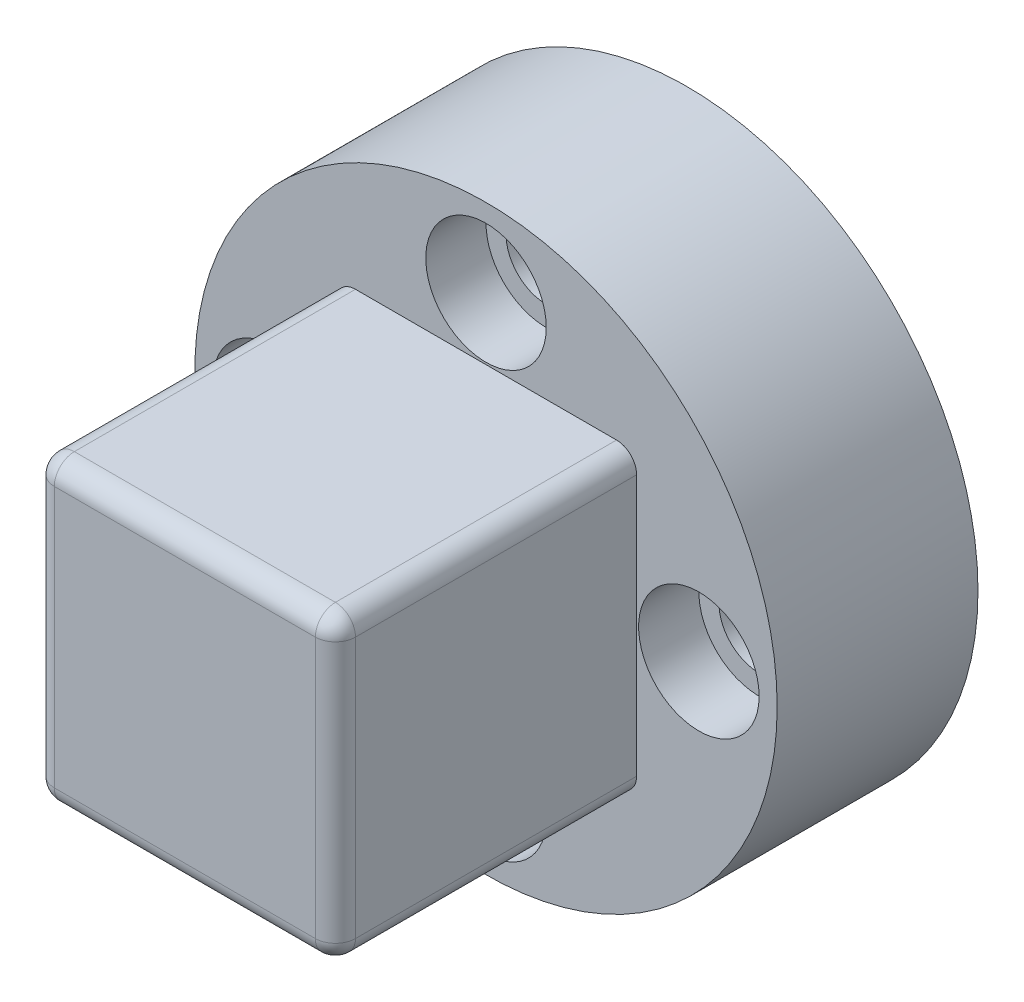
ISO-10303-21;
HEADER;
FILE_DESCRIPTION(('STEP AP214'),'2;1');
FILE_NAME('part.step','',(''),(''),'','','');
FILE_SCHEMA(('AUTOMOTIVE_DESIGN { 1 0 10303 214 1 1 1 1 }'));
ENDSEC;
DATA;
#1=APPLICATION_CONTEXT('core data for automotive mechanical design processes');
#2=APPLICATION_PROTOCOL_DEFINITION('international standard','automotive_design',2000,#1);
#3=PRODUCT_CONTEXT('',#1,'mechanical');
#4=PRODUCT('Part','Part','',(#3));
#5=PRODUCT_RELATED_PRODUCT_CATEGORY('part','',(#4));
#6=PRODUCT_DEFINITION_FORMATION('','',#4);
#7=PRODUCT_DEFINITION_CONTEXT('part definition',#1,'design');
#8=PRODUCT_DEFINITION('design','',#6,#7);
#9=PRODUCT_DEFINITION_SHAPE('','',#8);
#10=(LENGTH_UNIT() NAMED_UNIT(*) SI_UNIT(.MILLI.,.METRE.));
#11=(NAMED_UNIT(*) PLANE_ANGLE_UNIT() SI_UNIT($,.RADIAN.));
#12=(NAMED_UNIT(*) SI_UNIT($,.STERADIAN.) SOLID_ANGLE_UNIT());
#13=UNCERTAINTY_MEASURE_WITH_UNIT(LENGTH_MEASURE(1.E-05),#10,'distance_accuracy_value','');
#14=(GEOMETRIC_REPRESENTATION_CONTEXT(3) GLOBAL_UNCERTAINTY_ASSIGNED_CONTEXT((#13)) GLOBAL_UNIT_ASSIGNED_CONTEXT((#10,
#11,#12)) REPRESENTATION_CONTEXT('',''));
#15=CARTESIAN_POINT('',(0.,0.,0.));
#16=DIRECTION('',(0.,0.,1.));
#17=DIRECTION('',(1.,0.,0.));
#18=AXIS2_PLACEMENT_3D('',#15,#16,#17);
#19=CARTESIAN_POINT('',(0.,0.,7.));
#20=DIRECTION('',(0.,0.,1.));
#21=DIRECTION('',(1.,0.,0.));
#22=AXIS2_PLACEMENT_3D('',#19,#20,#21);
#23=PLANE('',#22);
#24=CARTESIAN_POINT('',(10.6,0.,7.));
#25=DIRECTION('',(0.,0.,1.));
#26=DIRECTION('',(1.,0.,0.));
#27=AXIS2_PLACEMENT_3D('',#24,#25,#26);
#28=CIRCLE('',#27,2.);
#29=CARTESIAN_POINT('',(12.6,0.,7.));
#30=VERTEX_POINT('',#29);
#31=EDGE_CURVE('E285',#30,#30,#28,.T.);
#32=ORIENTED_EDGE('',*,*,#31,.F.);
#33=EDGE_LOOP('',(#32));
#34=FACE_BOUND('',#33,.T.);
#35=CARTESIAN_POINT('',(10.6,0.,7.));
#36=DIRECTION('',(0.,0.,1.));
#37=DIRECTION('',(1.,0.,0.));
#38=AXIS2_PLACEMENT_3D('',#35,#36,#37);
#39=CIRCLE('',#38,3.);
#40=CARTESIAN_POINT('',(13.6,0.,7.));
#41=VERTEX_POINT('',#40);
#42=EDGE_CURVE('E239',#41,#41,#39,.T.);
#43=ORIENTED_EDGE('',*,*,#42,.T.);
#44=EDGE_LOOP('',(#43));
#45=FACE_BOUND('',#44,.T.);
#46=ADVANCED_FACE('F58',(#34,#45),#23,.T.);
#47=CARTESIAN_POINT('',(0.,-10.6,7.));
#48=DIRECTION('',(0.,0.,1.));
#49=DIRECTION('',(1.,0.,0.));
#50=AXIS2_PLACEMENT_3D('',#47,#48,#49);
#51=CIRCLE('',#50,2.);
#52=CARTESIAN_POINT('',(2.,-10.6,7.));
#53=VERTEX_POINT('',#52);
#54=EDGE_CURVE('E279',#53,#53,#51,.T.);
#55=ORIENTED_EDGE('',*,*,#54,.F.);
#56=EDGE_LOOP('',(#55));
#57=FACE_BOUND('',#56,.T.);
#58=CARTESIAN_POINT('',(0.,-10.6,7.));
#59=DIRECTION('',(0.,0.,1.));
#60=DIRECTION('',(1.,0.,0.));
#61=AXIS2_PLACEMENT_3D('',#58,#59,#60);
#62=CIRCLE('',#61,3.);
#63=CARTESIAN_POINT('',(3.,-10.6,7.));
#64=VERTEX_POINT('',#63);
#65=EDGE_CURVE('E259',#64,#64,#62,.T.);
#66=ORIENTED_EDGE('',*,*,#65,.T.);
#67=EDGE_LOOP('',(#66));
#68=FACE_BOUND('',#67,.T.);
#69=ADVANCED_FACE('F335',(#57,#68),#23,.T.);
#70=CARTESIAN_POINT('',(-10.6,0.,7.));
#71=DIRECTION('',(0.,0.,1.));
#72=DIRECTION('',(1.,0.,0.));
#73=AXIS2_PLACEMENT_3D('',#70,#71,#72);
#74=CIRCLE('',#73,2.);
#75=CARTESIAN_POINT('',(-8.6,0.,7.));
#76=VERTEX_POINT('',#75);
#77=EDGE_CURVE('E267',#76,#76,#74,.T.);
#78=ORIENTED_EDGE('',*,*,#77,.F.);
#79=EDGE_LOOP('',(#78));
#80=FACE_BOUND('',#79,.T.);
#81=CARTESIAN_POINT('',(-10.6,0.,7.));
#82=DIRECTION('',(0.,0.,1.));
#83=DIRECTION('',(1.,0.,0.));
#84=AXIS2_PLACEMENT_3D('',#81,#82,#83);
#85=CIRCLE('',#84,3.);
#86=CARTESIAN_POINT('',(-7.6,0.,7.));
#87=VERTEX_POINT('',#86);
#88=EDGE_CURVE('E262',#87,#87,#85,.T.);
#89=ORIENTED_EDGE('',*,*,#88,.T.);
#90=EDGE_LOOP('',(#89));
#91=FACE_BOUND('',#90,.T.);
#92=ADVANCED_FACE('F342',(#80,#91),#23,.T.);
#93=CARTESIAN_POINT('',(0.,10.6,7.));
#94=DIRECTION('',(0.,0.,1.));
#95=DIRECTION('',(1.,0.,0.));
#96=AXIS2_PLACEMENT_3D('',#93,#94,#95);
#97=CIRCLE('',#96,2.);
#98=CARTESIAN_POINT('',(2.,10.6,7.));
#99=VERTEX_POINT('',#98);
#100=EDGE_CURVE('E273',#99,#99,#97,.T.);
#101=ORIENTED_EDGE('',*,*,#100,.F.);
#102=EDGE_LOOP('',(#101));
#103=FACE_BOUND('',#102,.T.);
#104=CARTESIAN_POINT('',(0.,10.6,7.));
#105=DIRECTION('',(0.,0.,1.));
#106=DIRECTION('',(1.,0.,0.));
#107=AXIS2_PLACEMENT_3D('',#104,#105,#106);
#108=CIRCLE('',#107,3.);
#109=CARTESIAN_POINT('',(3.,10.6,7.));
#110=VERTEX_POINT('',#109);
#111=EDGE_CURVE('E244',#110,#110,#108,.T.);
#112=ORIENTED_EDGE('',*,*,#111,.T.);
#113=EDGE_LOOP('',(#112));
#114=FACE_BOUND('',#113,.T.);
#115=ADVANCED_FACE('F338',(#103,#114),#23,.T.);
#116=CARTESIAN_POINT('',(0.,0.,0.));
#117=DIRECTION('',(0.,0.,1.));
#118=DIRECTION('',(1.,0.,0.));
#119=AXIS2_PLACEMENT_3D('',#116,#117,#118);
#120=PLANE('',#119);
#121=CARTESIAN_POINT('',(0.,0.,0.));
#122=DIRECTION('',(0.,0.,1.));
#123=DIRECTION('',(1.,0.,0.));
#124=AXIS2_PLACEMENT_3D('',#121,#122,#123);
#125=CIRCLE('',#124,14.5);
#126=CARTESIAN_POINT('',(14.5,0.,0.));
#127=VERTEX_POINT('',#126);
#128=EDGE_CURVE('E165',#127,#127,#125,.T.);
#129=ORIENTED_EDGE('',*,*,#128,.F.);
#130=EDGE_LOOP('',(#129));
#131=FACE_BOUND('',#130,.T.);
#132=CARTESIAN_POINT('',(10.6,0.,0.));
#133=DIRECTION('',(0.,0.,1.));
#134=DIRECTION('',(1.,0.,0.));
#135=AXIS2_PLACEMENT_3D('',#132,#133,#134);
#136=CIRCLE('',#135,2.);
#137=CARTESIAN_POINT('',(12.6,0.,0.));
#138=VERTEX_POINT('',#137);
#139=EDGE_CURVE('E282',#138,#138,#136,.T.);
#140=ORIENTED_EDGE('',*,*,#139,.T.);
#141=EDGE_LOOP('',(#140));
#142=FACE_BOUND('',#141,.T.);
#143=CARTESIAN_POINT('',(0.,-10.6,0.));
#144=DIRECTION('',(0.,0.,1.));
#145=DIRECTION('',(1.,0.,0.));
#146=AXIS2_PLACEMENT_3D('',#143,#144,#145);
#147=CIRCLE('',#146,2.);
#148=CARTESIAN_POINT('',(2.,-10.6,0.));
#149=VERTEX_POINT('',#148);
#150=EDGE_CURVE('E276',#149,#149,#147,.T.);
#151=ORIENTED_EDGE('',*,*,#150,.T.);
#152=EDGE_LOOP('',(#151));
#153=FACE_BOUND('',#152,.T.);
#154=CARTESIAN_POINT('',(0.,10.6,0.));
#155=DIRECTION('',(0.,0.,1.));
#156=DIRECTION('',(1.,0.,0.));
#157=AXIS2_PLACEMENT_3D('',#154,#155,#156);
#158=CIRCLE('',#157,2.);
#159=CARTESIAN_POINT('',(2.,10.6,0.));
#160=VERTEX_POINT('',#159);
#161=EDGE_CURVE('E270',#160,#160,#158,.T.);
#162=ORIENTED_EDGE('',*,*,#161,.T.);
#163=EDGE_LOOP('',(#162));
#164=FACE_BOUND('',#163,.T.);
#165=CARTESIAN_POINT('',(-10.6,0.,0.));
#166=DIRECTION('',(0.,0.,1.));
#167=DIRECTION('',(1.,0.,0.));
#168=AXIS2_PLACEMENT_3D('',#165,#166,#167);
#169=CIRCLE('',#168,2.);
#170=CARTESIAN_POINT('',(-8.6,0.,0.));
#171=VERTEX_POINT('',#170);
#172=EDGE_CURVE('E256',#171,#171,#169,.T.);
#173=ORIENTED_EDGE('',*,*,#172,.T.);
#174=EDGE_LOOP('',(#173));
#175=FACE_BOUND('',#174,.T.);
#176=ADVANCED_FACE('F349',(#131,#142,#153,#164,#175),#120,.F.);
#177=CARTESIAN_POINT('',(0.,0.,7.));
#178=DIRECTION('',(0.,0.,-1.));
#179=DIRECTION('',(-1.,0.,0.));
#180=AXIS2_PLACEMENT_3D('',#177,#178,#179);
#181=CYLINDRICAL_SURFACE('',#180,14.5);
#182=ORIENTED_EDGE('',*,*,#128,.T.);
#183=EDGE_LOOP('',(#182));
#184=FACE_BOUND('',#183,.T.);
#185=CARTESIAN_POINT('',(0.,0.,10.));
#186=DIRECTION('',(0.,0.,1.));
#187=DIRECTION('',(1.,0.,0.));
#188=AXIS2_PLACEMENT_3D('',#185,#186,#187);
#189=CIRCLE('',#188,14.5);
#190=CARTESIAN_POINT('',(14.5,0.,10.));
#191=VERTEX_POINT('',#190);
#192=EDGE_CURVE('E253',#191,#191,#189,.T.);
#193=ORIENTED_EDGE('',*,*,#192,.F.);
#194=EDGE_LOOP('',(#193));
#195=FACE_BOUND('',#194,.T.);
#196=ADVANCED_FACE('F355',(#184,#195),#181,.T.);
#197=CARTESIAN_POINT('',(10.6,0.,7.));
#198=DIRECTION('',(0.,0.,-1.));
#199=DIRECTION('',(-1.,0.,0.));
#200=AXIS2_PLACEMENT_3D('',#197,#198,#199);
#201=CYLINDRICAL_SURFACE('',#200,2.);
#202=ORIENTED_EDGE('',*,*,#31,.T.);
#203=EDGE_LOOP('',(#202));
#204=FACE_BOUND('',#203,.T.);
#205=ORIENTED_EDGE('',*,*,#139,.F.);
#206=EDGE_LOOP('',(#205));
#207=FACE_BOUND('',#206,.T.);
#208=ADVANCED_FACE('F393',(#204,#207),#201,.F.);
#209=CARTESIAN_POINT('',(0.,-10.6,7.));
#210=DIRECTION('',(0.,0.,-1.));
#211=DIRECTION('',(-1.,0.,0.));
#212=AXIS2_PLACEMENT_3D('',#209,#210,#211);
#213=CYLINDRICAL_SURFACE('',#212,2.);
#214=ORIENTED_EDGE('',*,*,#54,.T.);
#215=EDGE_LOOP('',(#214));
#216=FACE_BOUND('',#215,.T.);
#217=ORIENTED_EDGE('',*,*,#150,.F.);
#218=EDGE_LOOP('',(#217));
#219=FACE_BOUND('',#218,.T.);
#220=ADVANCED_FACE('F390',(#216,#219),#213,.F.);
#221=CARTESIAN_POINT('',(0.,10.6,7.));
#222=DIRECTION('',(0.,0.,-1.));
#223=DIRECTION('',(-1.,0.,0.));
#224=AXIS2_PLACEMENT_3D('',#221,#222,#223);
#225=CYLINDRICAL_SURFACE('',#224,2.);
#226=ORIENTED_EDGE('',*,*,#100,.T.);
#227=EDGE_LOOP('',(#226));
#228=FACE_BOUND('',#227,.T.);
#229=ORIENTED_EDGE('',*,*,#161,.F.);
#230=EDGE_LOOP('',(#229));
#231=FACE_BOUND('',#230,.T.);
#232=ADVANCED_FACE('F375',(#228,#231),#225,.F.);
#233=CARTESIAN_POINT('',(-10.6,0.,7.));
#234=DIRECTION('',(0.,0.,-1.));
#235=DIRECTION('',(-1.,0.,0.));
#236=AXIS2_PLACEMENT_3D('',#233,#234,#235);
#237=CYLINDRICAL_SURFACE('',#236,2.);
#238=ORIENTED_EDGE('',*,*,#77,.T.);
#239=EDGE_LOOP('',(#238));
#240=FACE_BOUND('',#239,.T.);
#241=ORIENTED_EDGE('',*,*,#172,.F.);
#242=EDGE_LOOP('',(#241));
#243=FACE_BOUND('',#242,.T.);
#244=ADVANCED_FACE('F365',(#240,#243),#237,.F.);
#245=CARTESIAN_POINT('',(0.,10.6,10.));
#246=DIRECTION('',(0.,0.,-1.));
#247=DIRECTION('',(-1.,0.,0.));
#248=AXIS2_PLACEMENT_3D('',#245,#246,#247);
#249=CYLINDRICAL_SURFACE('',#248,3.);
#250=CARTESIAN_POINT('',(0.,10.6,10.));
#251=DIRECTION('',(0.,0.,1.));
#252=DIRECTION('',(1.,0.,0.));
#253=AXIS2_PLACEMENT_3D('',#250,#251,#252);
#254=CIRCLE('',#253,3.);
#255=CARTESIAN_POINT('',(3.,10.6,10.));
#256=VERTEX_POINT('',#255);
#257=EDGE_CURVE('E250',#256,#256,#254,.T.);
#258=ORIENTED_EDGE('',*,*,#257,.T.);
#259=EDGE_LOOP('',(#258));
#260=FACE_BOUND('',#259,.T.);
#261=ORIENTED_EDGE('',*,*,#111,.F.);
#262=EDGE_LOOP('',(#261));
#263=FACE_BOUND('',#262,.T.);
#264=ADVANCED_FACE('F362',(#260,#263),#249,.F.);
#265=CARTESIAN_POINT('',(-10.6,0.,10.));
#266=DIRECTION('',(0.,0.,-1.));
#267=DIRECTION('',(-1.,0.,0.));
#268=AXIS2_PLACEMENT_3D('',#265,#266,#267);
#269=CYLINDRICAL_SURFACE('',#268,3.);
#270=CARTESIAN_POINT('',(-10.6,0.,10.));
#271=DIRECTION('',(0.,0.,1.));
#272=DIRECTION('',(1.,0.,0.));
#273=AXIS2_PLACEMENT_3D('',#270,#271,#272);
#274=CIRCLE('',#273,3.);
#275=CARTESIAN_POINT('',(-7.6,0.,10.));
#276=VERTEX_POINT('',#275);
#277=EDGE_CURVE('E247',#276,#276,#274,.T.);
#278=ORIENTED_EDGE('',*,*,#277,.T.);
#279=EDGE_LOOP('',(#278));
#280=FACE_BOUND('',#279,.T.);
#281=ORIENTED_EDGE('',*,*,#88,.F.);
#282=EDGE_LOOP('',(#281));
#283=FACE_BOUND('',#282,.T.);
#284=ADVANCED_FACE('F364',(#280,#283),#269,.F.);
#285=CARTESIAN_POINT('',(0.,-10.6,10.));
#286=DIRECTION('',(0.,0.,-1.));
#287=DIRECTION('',(-1.,0.,0.));
#288=AXIS2_PLACEMENT_3D('',#285,#286,#287);
#289=CYLINDRICAL_SURFACE('',#288,3.);
#290=CARTESIAN_POINT('',(0.,-10.6,10.));
#291=DIRECTION('',(0.,0.,1.));
#292=DIRECTION('',(1.,0.,0.));
#293=AXIS2_PLACEMENT_3D('',#290,#291,#292);
#294=CIRCLE('',#293,3.);
#295=CARTESIAN_POINT('',(3.,-10.6,10.));
#296=VERTEX_POINT('',#295);
#297=EDGE_CURVE('E243',#296,#296,#294,.T.);
#298=ORIENTED_EDGE('',*,*,#297,.T.);
#299=EDGE_LOOP('',(#298));
#300=FACE_BOUND('',#299,.T.);
#301=ORIENTED_EDGE('',*,*,#65,.F.);
#302=EDGE_LOOP('',(#301));
#303=FACE_BOUND('',#302,.T.);
#304=ADVANCED_FACE('F372',(#300,#303),#289,.F.);
#305=CARTESIAN_POINT('',(10.6,0.,10.));
#306=DIRECTION('',(0.,0.,-1.));
#307=DIRECTION('',(-1.,0.,0.));
#308=AXIS2_PLACEMENT_3D('',#305,#306,#307);
#309=CYLINDRICAL_SURFACE('',#308,3.);
#310=CARTESIAN_POINT('',(10.6,0.,10.));
#311=DIRECTION('',(0.,0.,1.));
#312=DIRECTION('',(1.,0.,0.));
#313=AXIS2_PLACEMENT_3D('',#310,#311,#312);
#314=CIRCLE('',#313,3.);
#315=CARTESIAN_POINT('',(13.6,0.,10.));
#316=VERTEX_POINT('',#315);
#317=EDGE_CURVE('E240',#316,#316,#314,.T.);
#318=ORIENTED_EDGE('',*,*,#317,.T.);
#319=EDGE_LOOP('',(#318));
#320=FACE_BOUND('',#319,.T.);
#321=ORIENTED_EDGE('',*,*,#42,.F.);
#322=EDGE_LOOP('',(#321));
#323=FACE_BOUND('',#322,.T.);
#324=ADVANCED_FACE('F383',(#320,#323),#309,.F.);
#325=CARTESIAN_POINT('',(0.,0.,10.));
#326=DIRECTION('',(0.,0.,1.));
#327=DIRECTION('',(1.,0.,0.));
#328=AXIS2_PLACEMENT_3D('',#325,#326,#327);
#329=PLANE('',#328);
#330=DIRECTION('',(0.,1.,0.));
#331=VECTOR('',#330,1.);
#332=CARTESIAN_POINT('',(7.5,-7.5,10.));
#333=LINE('',#332,#331);
#334=CARTESIAN_POINT('',(7.5,-6.5,10.));
#335=VERTEX_POINT('',#334);
#336=CARTESIAN_POINT('',(7.5,6.5,10.));
#337=VERTEX_POINT('',#336);
#338=EDGE_CURVE('E223',#335,#337,#333,.T.);
#339=ORIENTED_EDGE('',*,*,#338,.F.);
#340=CARTESIAN_POINT('',(6.5,-6.5,10.));
#341=DIRECTION('',(0.,0.,1.));
#342=DIRECTION('',(1.,0.,0.));
#343=AXIS2_PLACEMENT_3D('',#340,#341,#342);
#344=CIRCLE('',#343,1.);
#345=CARTESIAN_POINT('',(6.5,-7.5,10.));
#346=VERTEX_POINT('',#345);
#347=EDGE_CURVE('E67',#335,#346,#344,.F.);
#348=ORIENTED_EDGE('',*,*,#347,.T.);
#349=DIRECTION('',(1.,0.,0.));
#350=VECTOR('',#349,1.);
#351=CARTESIAN_POINT('',(-7.5,-7.5,10.));
#352=LINE('',#351,#350);
#353=CARTESIAN_POINT('',(-6.5,-7.5,10.));
#354=VERTEX_POINT('',#353);
#355=EDGE_CURVE('E236',#354,#346,#352,.T.);
#356=ORIENTED_EDGE('',*,*,#355,.F.);
#357=CARTESIAN_POINT('',(-6.5,-6.5,10.));
#358=DIRECTION('',(0.,0.,1.));
#359=DIRECTION('',(1.,0.,0.));
#360=AXIS2_PLACEMENT_3D('',#357,#358,#359);
#361=CIRCLE('',#360,1.);
#362=CARTESIAN_POINT('',(-7.5,-6.5,10.));
#363=VERTEX_POINT('',#362);
#364=EDGE_CURVE('E12',#354,#363,#361,.F.);
#365=ORIENTED_EDGE('',*,*,#364,.T.);
#366=DIRECTION('',(0.,-1.,0.));
#367=VECTOR('',#366,1.);
#368=CARTESIAN_POINT('',(-7.5,-7.5,10.));
#369=LINE('',#368,#367);
#370=CARTESIAN_POINT('',(-7.5,6.5,10.));
#371=VERTEX_POINT('',#370);
#372=EDGE_CURVE('E232',#371,#363,#369,.T.);
#373=ORIENTED_EDGE('',*,*,#372,.F.);
#374=CARTESIAN_POINT('',(-6.5,6.5,10.));
#375=DIRECTION('',(0.,0.,1.));
#376=DIRECTION('',(1.,0.,0.));
#377=AXIS2_PLACEMENT_3D('',#374,#375,#376);
#378=CIRCLE('',#377,1.);
#379=CARTESIAN_POINT('',(-6.5,7.5,10.));
#380=VERTEX_POINT('',#379);
#381=EDGE_CURVE('E196',#371,#380,#378,.F.);
#382=ORIENTED_EDGE('',*,*,#381,.T.);
#383=DIRECTION('',(-1.,0.,0.));
#384=VECTOR('',#383,1.);
#385=CARTESIAN_POINT('',(-7.5,7.5,10.));
#386=LINE('',#385,#384);
#387=CARTESIAN_POINT('',(6.5,7.5,10.));
#388=VERTEX_POINT('',#387);
#389=EDGE_CURVE('E226',#388,#380,#386,.T.);
#390=ORIENTED_EDGE('',*,*,#389,.F.);
#391=CARTESIAN_POINT('',(6.5,6.5,10.));
#392=DIRECTION('',(0.,0.,1.));
#393=DIRECTION('',(1.,0.,0.));
#394=AXIS2_PLACEMENT_3D('',#391,#392,#393);
#395=CIRCLE('',#394,1.);
#396=EDGE_CURVE('E198',#388,#337,#395,.F.);
#397=ORIENTED_EDGE('',*,*,#396,.T.);
#398=EDGE_LOOP('',(#339,#348,#356,#365,#373,#382,#390,#397));
#399=FACE_BOUND('',#398,.T.);
#400=ORIENTED_EDGE('',*,*,#317,.F.);
#401=EDGE_LOOP('',(#400));
#402=FACE_BOUND('',#401,.T.);
#403=ORIENTED_EDGE('',*,*,#297,.F.);
#404=EDGE_LOOP('',(#403));
#405=FACE_BOUND('',#404,.T.);
#406=ORIENTED_EDGE('',*,*,#277,.F.);
#407=EDGE_LOOP('',(#406));
#408=FACE_BOUND('',#407,.T.);
#409=ORIENTED_EDGE('',*,*,#257,.F.);
#410=EDGE_LOOP('',(#409));
#411=FACE_BOUND('',#410,.T.);
#412=ORIENTED_EDGE('',*,*,#192,.T.);
#413=EDGE_LOOP('',(#412));
#414=FACE_BOUND('',#413,.T.);
#415=ADVANCED_FACE('F317',(#399,#402,#405,#408,#411,#414),#329,.T.);
#416=CARTESIAN_POINT('',(7.5,-7.5,25.));
#417=DIRECTION('',(-1.,0.,0.));
#418=DIRECTION('',(0.,0.,1.));
#419=AXIS2_PLACEMENT_3D('',#416,#417,#418);
#420=PLANE('',#419);
#421=ORIENTED_EDGE('',*,*,#338,.T.);
#422=DIRECTION('',(0.,0.,-1.));
#423=VECTOR('',#422,1.);
#424=CARTESIAN_POINT('',(7.5,6.5,25.));
#425=LINE('',#424,#423);
#426=CARTESIAN_POINT('',(7.5,6.5,24.));
#427=VERTEX_POINT('',#426);
#428=EDGE_CURVE('E184',#337,#427,#425,.F.);
#429=ORIENTED_EDGE('',*,*,#428,.T.);
#430=DIRECTION('',(0.,1.,0.));
#431=VECTOR('',#430,1.);
#432=CARTESIAN_POINT('',(7.5,-7.5,24.));
#433=LINE('',#432,#431);
#434=CARTESIAN_POINT('',(7.5,-6.5,24.));
#435=VERTEX_POINT('',#434);
#436=EDGE_CURVE('E182',#427,#435,#433,.F.);
#437=ORIENTED_EDGE('',*,*,#436,.T.);
#438=DIRECTION('',(0.,0.,-1.));
#439=VECTOR('',#438,1.);
#440=CARTESIAN_POINT('',(7.5,-6.5,25.));
#441=LINE('',#440,#439);
#442=EDGE_CURVE('E180',#435,#335,#441,.T.);
#443=ORIENTED_EDGE('',*,*,#442,.T.);
#444=EDGE_LOOP('',(#421,#429,#437,#443));
#445=FACE_BOUND('',#444,.T.);
#446=ADVANCED_FACE('F529',(#445),#420,.F.);
#447=CARTESIAN_POINT('',(-7.5,7.5,25.));
#448=DIRECTION('',(0.,-1.,0.));
#449=DIRECTION('',(0.,0.,-1.));
#450=AXIS2_PLACEMENT_3D('',#447,#448,#449);
#451=PLANE('',#450);
#452=ORIENTED_EDGE('',*,*,#389,.T.);
#453=DIRECTION('',(0.,0.,-1.));
#454=VECTOR('',#453,1.);
#455=CARTESIAN_POINT('',(-6.5,7.5,25.));
#456=LINE('',#455,#454);
#457=CARTESIAN_POINT('',(-6.5,7.5,24.));
#458=VERTEX_POINT('',#457);
#459=EDGE_CURVE('E178',#380,#458,#456,.F.);
#460=ORIENTED_EDGE('',*,*,#459,.T.);
#461=DIRECTION('',(-1.,0.,0.));
#462=VECTOR('',#461,1.);
#463=CARTESIAN_POINT('',(-7.5,7.5,24.));
#464=LINE('',#463,#462);
#465=CARTESIAN_POINT('',(6.5,7.5,24.));
#466=VERTEX_POINT('',#465);
#467=EDGE_CURVE('E143',#458,#466,#464,.F.);
#468=ORIENTED_EDGE('',*,*,#467,.T.);
#469=DIRECTION('',(0.,0.,-1.));
#470=VECTOR('',#469,1.);
#471=CARTESIAN_POINT('',(6.5,7.5,25.));
#472=LINE('',#471,#470);
#473=EDGE_CURVE('E171',#466,#388,#472,.T.);
#474=ORIENTED_EDGE('',*,*,#473,.T.);
#475=EDGE_LOOP('',(#452,#460,#468,#474));
#476=FACE_BOUND('',#475,.T.);
#477=ADVANCED_FACE('F309',(#476),#451,.F.);
#478=CARTESIAN_POINT('',(-7.5,-7.5,25.));
#479=DIRECTION('',(1.,0.,0.));
#480=DIRECTION('',(0.,0.,-1.));
#481=AXIS2_PLACEMENT_3D('',#478,#479,#480);
#482=PLANE('',#481);
#483=DIRECTION('',(0.,-1.,0.));
#484=VECTOR('',#483,1.);
#485=CARTESIAN_POINT('',(-7.5,-7.5,24.));
#486=LINE('',#485,#484);
#487=CARTESIAN_POINT('',(-7.5,-6.5,24.));
#488=VERTEX_POINT('',#487);
#489=CARTESIAN_POINT('',(-7.5,6.5,24.));
#490=VERTEX_POINT('',#489);
#491=EDGE_CURVE('E75',#488,#490,#486,.F.);
#492=ORIENTED_EDGE('',*,*,#491,.T.);
#493=DIRECTION('',(0.,0.,-1.));
#494=VECTOR('',#493,1.);
#495=CARTESIAN_POINT('',(-7.5,6.5,25.));
#496=LINE('',#495,#494);
#497=EDGE_CURVE('E194',#490,#371,#496,.T.);
#498=ORIENTED_EDGE('',*,*,#497,.T.);
#499=ORIENTED_EDGE('',*,*,#372,.T.);
#500=DIRECTION('',(0.,0.,-1.));
#501=VECTOR('',#500,1.);
#502=CARTESIAN_POINT('',(-7.5,-6.5,25.));
#503=LINE('',#502,#501);
#504=EDGE_CURVE('E80',#363,#488,#503,.F.);
#505=ORIENTED_EDGE('',*,*,#504,.T.);
#506=EDGE_LOOP('',(#492,#498,#499,#505));
#507=FACE_BOUND('',#506,.T.);
#508=ADVANCED_FACE('F315',(#507),#482,.F.);
#509=CARTESIAN_POINT('',(-7.5,-7.5,25.));
#510=DIRECTION('',(0.,1.,0.));
#511=DIRECTION('',(0.,0.,1.));
#512=AXIS2_PLACEMENT_3D('',#509,#510,#511);
#513=PLANE('',#512);
#514=ORIENTED_EDGE('',*,*,#355,.T.);
#515=DIRECTION('',(0.,0.,-1.));
#516=VECTOR('',#515,1.);
#517=CARTESIAN_POINT('',(6.5,-7.5,25.));
#518=LINE('',#517,#516);
#519=CARTESIAN_POINT('',(6.5,-7.5,24.));
#520=VERTEX_POINT('',#519);
#521=EDGE_CURVE('E190',#346,#520,#518,.F.);
#522=ORIENTED_EDGE('',*,*,#521,.T.);
#523=DIRECTION('',(1.,0.,0.));
#524=VECTOR('',#523,1.);
#525=CARTESIAN_POINT('',(-7.5,-7.5,24.));
#526=LINE('',#525,#524);
#527=CARTESIAN_POINT('',(-6.5,-7.5,24.));
#528=VERTEX_POINT('',#527);
#529=EDGE_CURVE('E188',#520,#528,#526,.F.);
#530=ORIENTED_EDGE('',*,*,#529,.T.);
#531=DIRECTION('',(0.,0.,-1.));
#532=VECTOR('',#531,1.);
#533=CARTESIAN_POINT('',(-6.5,-7.5,25.));
#534=LINE('',#533,#532);
#535=EDGE_CURVE('E186',#528,#354,#534,.T.);
#536=ORIENTED_EDGE('',*,*,#535,.T.);
#537=EDGE_LOOP('',(#514,#522,#530,#536));
#538=FACE_BOUND('',#537,.T.);
#539=ADVANCED_FACE('F506',(#538),#513,.F.);
#540=CARTESIAN_POINT('',(0.,0.,25.));
#541=DIRECTION('',(0.,0.,-1.));
#542=DIRECTION('',(-1.,0.,0.));
#543=AXIS2_PLACEMENT_3D('',#540,#541,#542);
#544=PLANE('',#543);
#545=DIRECTION('',(0.,1.,0.));
#546=VECTOR('',#545,1.);
#547=CARTESIAN_POINT('',(6.5,0.,25.));
#548=LINE('',#547,#546);
#549=CARTESIAN_POINT('',(6.5,-6.5,25.));
#550=VERTEX_POINT('',#549);
#551=CARTESIAN_POINT('',(6.5,6.5,25.));
#552=VERTEX_POINT('',#551);
#553=EDGE_CURVE('E169',#550,#552,#548,.T.);
#554=ORIENTED_EDGE('',*,*,#553,.T.);
#555=DIRECTION('',(-1.,0.,0.));
#556=VECTOR('',#555,1.);
#557=CARTESIAN_POINT('',(0.,6.5,25.));
#558=LINE('',#557,#556);
#559=CARTESIAN_POINT('',(-6.5,6.5,25.));
#560=VERTEX_POINT('',#559);
#561=EDGE_CURVE('E141',#552,#560,#558,.T.);
#562=ORIENTED_EDGE('',*,*,#561,.T.);
#563=DIRECTION('',(0.,-1.,0.));
#564=VECTOR('',#563,1.);
#565=CARTESIAN_POINT('',(-6.5,0.,25.));
#566=LINE('',#565,#564);
#567=CARTESIAN_POINT('',(-6.5,-6.5,25.));
#568=VERTEX_POINT('',#567);
#569=EDGE_CURVE('E158',#560,#568,#566,.T.);
#570=ORIENTED_EDGE('',*,*,#569,.T.);
#571=DIRECTION('',(1.,0.,0.));
#572=VECTOR('',#571,1.);
#573=CARTESIAN_POINT('',(0.,-6.5,25.));
#574=LINE('',#573,#572);
#575=EDGE_CURVE('E164',#568,#550,#574,.T.);
#576=ORIENTED_EDGE('',*,*,#575,.T.);
#577=EDGE_LOOP('',(#554,#562,#570,#576));
#578=FACE_BOUND('',#577,.T.);
#579=ADVANCED_FACE('F167',(#578),#544,.F.);
#580=CARTESIAN_POINT('',(6.5,-6.5,25.));
#581=DIRECTION('',(0.,0.,-1.));
#582=DIRECTION('',(-1.,0.,0.));
#583=AXIS2_PLACEMENT_3D('',#580,#581,#582);
#584=CYLINDRICAL_SURFACE('',#583,1.);
#585=ORIENTED_EDGE('',*,*,#347,.F.);
#586=ORIENTED_EDGE('',*,*,#442,.F.);
#587=CARTESIAN_POINT('',(6.5,-6.5,24.));
#588=DIRECTION('',(0.,0.,1.));
#589=DIRECTION('',(1.,0.,0.));
#590=AXIS2_PLACEMENT_3D('',#587,#588,#589);
#591=CIRCLE('',#590,1.);
#592=EDGE_CURVE('E62',#520,#435,#591,.T.);
#593=ORIENTED_EDGE('',*,*,#592,.F.);
#594=ORIENTED_EDGE('',*,*,#521,.F.);
#595=EDGE_LOOP('',(#585,#586,#593,#594));
#596=FACE_BOUND('',#595,.T.);
#597=ADVANCED_FACE('F60',(#596),#584,.T.);
#598=CARTESIAN_POINT('',(0.,-6.5,24.));
#599=DIRECTION('',(1.,0.,0.));
#600=DIRECTION('',(0.,0.,-1.));
#601=AXIS2_PLACEMENT_3D('',#598,#599,#600);
#602=CYLINDRICAL_SURFACE('',#601,1.);
#603=CARTESIAN_POINT('',(-6.5,-6.5,24.));
#604=DIRECTION('',(-1.,0.,0.));
#605=DIRECTION('',(0.,0.,1.));
#606=AXIS2_PLACEMENT_3D('',#603,#604,#605);
#607=CIRCLE('',#606,1.);
#608=EDGE_CURVE('E215',#528,#568,#607,.T.);
#609=ORIENTED_EDGE('',*,*,#608,.F.);
#610=ORIENTED_EDGE('',*,*,#529,.F.);
#611=CARTESIAN_POINT('',(6.5,-6.5,24.));
#612=DIRECTION('',(1.,0.,0.));
#613=DIRECTION('',(0.,0.,-1.));
#614=AXIS2_PLACEMENT_3D('',#611,#612,#613);
#615=CIRCLE('',#614,1.);
#616=EDGE_CURVE('E217',#550,#520,#615,.T.);
#617=ORIENTED_EDGE('',*,*,#616,.F.);
#618=ORIENTED_EDGE('',*,*,#575,.F.);
#619=EDGE_LOOP('',(#609,#610,#617,#618));
#620=FACE_BOUND('',#619,.T.);
#621=ADVANCED_FACE('F294',(#620),#602,.T.);
#622=CARTESIAN_POINT('',(-6.5,-6.5,25.));
#623=DIRECTION('',(0.,0.,-1.));
#624=DIRECTION('',(-1.,0.,0.));
#625=AXIS2_PLACEMENT_3D('',#622,#623,#624);
#626=CYLINDRICAL_SURFACE('',#625,1.);
#627=ORIENTED_EDGE('',*,*,#364,.F.);
#628=ORIENTED_EDGE('',*,*,#535,.F.);
#629=CARTESIAN_POINT('',(-6.5,-6.5,24.));
#630=DIRECTION('',(0.,0.,1.));
#631=DIRECTION('',(1.,0.,0.));
#632=AXIS2_PLACEMENT_3D('',#629,#630,#631);
#633=CIRCLE('',#632,1.);
#634=EDGE_CURVE('E212',#488,#528,#633,.T.);
#635=ORIENTED_EDGE('',*,*,#634,.F.);
#636=ORIENTED_EDGE('',*,*,#504,.F.);
#637=EDGE_LOOP('',(#627,#628,#635,#636));
#638=FACE_BOUND('',#637,.T.);
#639=ADVANCED_FACE('F323',(#638),#626,.T.);
#640=CARTESIAN_POINT('',(6.5,-6.5,24.));
#641=DIRECTION('',(0.,0.,1.));
#642=DIRECTION('',(1.,0.,0.));
#643=AXIS2_PLACEMENT_3D('',#640,#641,#642);
#644=SPHERICAL_SURFACE('',#643,1.);
#645=ORIENTED_EDGE('',*,*,#616,.T.);
#646=ORIENTED_EDGE('',*,*,#592,.T.);
#647=CARTESIAN_POINT('',(6.5,-6.5,24.));
#648=DIRECTION('',(0.,-1.,0.));
#649=DIRECTION('',(0.,0.,-1.));
#650=AXIS2_PLACEMENT_3D('',#647,#648,#649);
#651=CIRCLE('',#650,1.);
#652=EDGE_CURVE('E209',#550,#435,#651,.F.);
#653=ORIENTED_EDGE('',*,*,#652,.F.);
#654=EDGE_LOOP('',(#645,#646,#653));
#655=FACE_BOUND('',#654,.T.);
#656=ADVANCED_FACE('F295',(#655),#644,.T.);
#657=CARTESIAN_POINT('',(-6.5,-6.5,24.));
#658=DIRECTION('',(0.,0.,1.));
#659=DIRECTION('',(1.,0.,0.));
#660=AXIS2_PLACEMENT_3D('',#657,#658,#659);
#661=SPHERICAL_SURFACE('',#660,1.);
#662=ORIENTED_EDGE('',*,*,#634,.T.);
#663=ORIENTED_EDGE('',*,*,#608,.T.);
#664=CARTESIAN_POINT('',(-6.5,-6.5,24.));
#665=DIRECTION('',(0.,-1.,0.));
#666=DIRECTION('',(0.,0.,-1.));
#667=AXIS2_PLACEMENT_3D('',#664,#665,#666);
#668=CIRCLE('',#667,1.);
#669=EDGE_CURVE('E161',#488,#568,#668,.F.);
#670=ORIENTED_EDGE('',*,*,#669,.F.);
#671=EDGE_LOOP('',(#662,#663,#670));
#672=FACE_BOUND('',#671,.T.);
#673=ADVANCED_FACE('F325',(#672),#661,.T.);
#674=CARTESIAN_POINT('',(6.5,6.5,25.));
#675=DIRECTION('',(0.,0.,-1.));
#676=DIRECTION('',(-1.,0.,0.));
#677=AXIS2_PLACEMENT_3D('',#674,#675,#676);
#678=CYLINDRICAL_SURFACE('',#677,1.);
#679=ORIENTED_EDGE('',*,*,#396,.F.);
#680=ORIENTED_EDGE('',*,*,#473,.F.);
#681=CARTESIAN_POINT('',(6.5,6.5,24.));
#682=DIRECTION('',(0.,0.,1.));
#683=DIRECTION('',(1.,0.,0.));
#684=AXIS2_PLACEMENT_3D('',#681,#682,#683);
#685=CIRCLE('',#684,1.);
#686=EDGE_CURVE('E205',#427,#466,#685,.T.);
#687=ORIENTED_EDGE('',*,*,#686,.F.);
#688=ORIENTED_EDGE('',*,*,#428,.F.);
#689=EDGE_LOOP('',(#679,#680,#687,#688));
#690=FACE_BOUND('',#689,.T.);
#691=ADVANCED_FACE('F306',(#690),#678,.T.);
#692=CARTESIAN_POINT('',(6.5,0.,24.));
#693=DIRECTION('',(0.,1.,0.));
#694=DIRECTION('',(0.,0.,1.));
#695=AXIS2_PLACEMENT_3D('',#692,#693,#694);
#696=CYLINDRICAL_SURFACE('',#695,1.);
#697=ORIENTED_EDGE('',*,*,#652,.T.);
#698=ORIENTED_EDGE('',*,*,#436,.F.);
#699=CARTESIAN_POINT('',(6.5,6.5,24.));
#700=DIRECTION('',(0.,1.,0.));
#701=DIRECTION('',(0.,0.,1.));
#702=AXIS2_PLACEMENT_3D('',#699,#700,#701);
#703=CIRCLE('',#702,1.);
#704=EDGE_CURVE('E155',#552,#427,#703,.T.);
#705=ORIENTED_EDGE('',*,*,#704,.F.);
#706=ORIENTED_EDGE('',*,*,#553,.F.);
#707=EDGE_LOOP('',(#697,#698,#705,#706));
#708=FACE_BOUND('',#707,.T.);
#709=ADVANCED_FACE('F298',(#708),#696,.T.);
#710=CARTESIAN_POINT('',(-6.5,0.,24.));
#711=DIRECTION('',(0.,-1.,0.));
#712=DIRECTION('',(0.,0.,-1.));
#713=AXIS2_PLACEMENT_3D('',#710,#711,#712);
#714=CYLINDRICAL_SURFACE('',#713,1.);
#715=ORIENTED_EDGE('',*,*,#669,.T.);
#716=ORIENTED_EDGE('',*,*,#569,.F.);
#717=CARTESIAN_POINT('',(-6.5,6.5,24.));
#718=DIRECTION('',(0.,1.,0.));
#719=DIRECTION('',(0.,0.,1.));
#720=AXIS2_PLACEMENT_3D('',#717,#718,#719);
#721=CIRCLE('',#720,1.);
#722=EDGE_CURVE('E149',#490,#560,#721,.T.);
#723=ORIENTED_EDGE('',*,*,#722,.F.);
#724=ORIENTED_EDGE('',*,*,#491,.F.);
#725=EDGE_LOOP('',(#715,#716,#723,#724));
#726=FACE_BOUND('',#725,.T.);
#727=ADVANCED_FACE('F159',(#726),#714,.T.);
#728=CARTESIAN_POINT('',(-6.5,6.5,25.));
#729=DIRECTION('',(0.,0.,-1.));
#730=DIRECTION('',(-1.,0.,0.));
#731=AXIS2_PLACEMENT_3D('',#728,#729,#730);
#732=CYLINDRICAL_SURFACE('',#731,1.);
#733=ORIENTED_EDGE('',*,*,#381,.F.);
#734=ORIENTED_EDGE('',*,*,#497,.F.);
#735=CARTESIAN_POINT('',(-6.5,6.5,24.));
#736=DIRECTION('',(0.,0.,1.));
#737=DIRECTION('',(1.,0.,0.));
#738=AXIS2_PLACEMENT_3D('',#735,#736,#737);
#739=CIRCLE('',#738,1.);
#740=EDGE_CURVE('E153',#458,#490,#739,.T.);
#741=ORIENTED_EDGE('',*,*,#740,.F.);
#742=ORIENTED_EDGE('',*,*,#459,.F.);
#743=EDGE_LOOP('',(#733,#734,#741,#742));
#744=FACE_BOUND('',#743,.T.);
#745=ADVANCED_FACE('F313',(#744),#732,.T.);
#746=CARTESIAN_POINT('',(6.5,6.5,24.));
#747=DIRECTION('',(0.,0.,1.));
#748=DIRECTION('',(1.,0.,0.));
#749=AXIS2_PLACEMENT_3D('',#746,#747,#748);
#750=SPHERICAL_SURFACE('',#749,1.);
#751=ORIENTED_EDGE('',*,*,#704,.T.);
#752=ORIENTED_EDGE('',*,*,#686,.T.);
#753=CARTESIAN_POINT('',(6.5,6.5,24.));
#754=DIRECTION('',(1.,0.,0.));
#755=DIRECTION('',(0.,0.,-1.));
#756=AXIS2_PLACEMENT_3D('',#753,#754,#755);
#757=CIRCLE('',#756,1.);
#758=EDGE_CURVE('E146',#552,#466,#757,.F.);
#759=ORIENTED_EDGE('',*,*,#758,.F.);
#760=EDGE_LOOP('',(#751,#752,#759));
#761=FACE_BOUND('',#760,.T.);
#762=ADVANCED_FACE('F302',(#761),#750,.T.);
#763=CARTESIAN_POINT('',(-6.5,6.5,24.));
#764=DIRECTION('',(0.,0.,1.));
#765=DIRECTION('',(1.,0.,0.));
#766=AXIS2_PLACEMENT_3D('',#763,#764,#765);
#767=SPHERICAL_SURFACE('',#766,1.);
#768=ORIENTED_EDGE('',*,*,#740,.T.);
#769=ORIENTED_EDGE('',*,*,#722,.T.);
#770=CARTESIAN_POINT('',(-6.5,6.5,24.));
#771=DIRECTION('',(-1.,0.,0.));
#772=DIRECTION('',(0.,0.,1.));
#773=AXIS2_PLACEMENT_3D('',#770,#771,#772);
#774=CIRCLE('',#773,1.);
#775=EDGE_CURVE('E137',#458,#560,#774,.F.);
#776=ORIENTED_EDGE('',*,*,#775,.F.);
#777=EDGE_LOOP('',(#768,#769,#776));
#778=FACE_BOUND('',#777,.T.);
#779=ADVANCED_FACE('F151',(#778),#767,.T.);
#780=CARTESIAN_POINT('',(0.,6.5,24.));
#781=DIRECTION('',(-1.,0.,0.));
#782=DIRECTION('',(0.,0.,1.));
#783=AXIS2_PLACEMENT_3D('',#780,#781,#782);
#784=CYLINDRICAL_SURFACE('',#783,1.);
#785=ORIENTED_EDGE('',*,*,#758,.T.);
#786=ORIENTED_EDGE('',*,*,#467,.F.);
#787=ORIENTED_EDGE('',*,*,#775,.T.);
#788=ORIENTED_EDGE('',*,*,#561,.F.);
#789=EDGE_LOOP('',(#785,#786,#787,#788));
#790=FACE_BOUND('',#789,.T.);
#791=ADVANCED_FACE('F139',(#790),#784,.T.);
#792=CLOSED_SHELL('',(#46,#69,#92,#115,#176,#196,#208,#220,#232,#244,#264,#284,#304,#324,#415,
#446,#477,#508,#539,#579,#597,#621,#639,#656,#673,#691,#709,#727,#745,#762,#779,#791));
#793=MANIFOLD_SOLID_BREP('B2',#792);
#794=ADVANCED_BREP_SHAPE_REPRESENTATION('',(#18,#793),#14);
#795=SHAPE_DEFINITION_REPRESENTATION(#9,#794);
ENDSEC;
END-ISO-10303-21;
